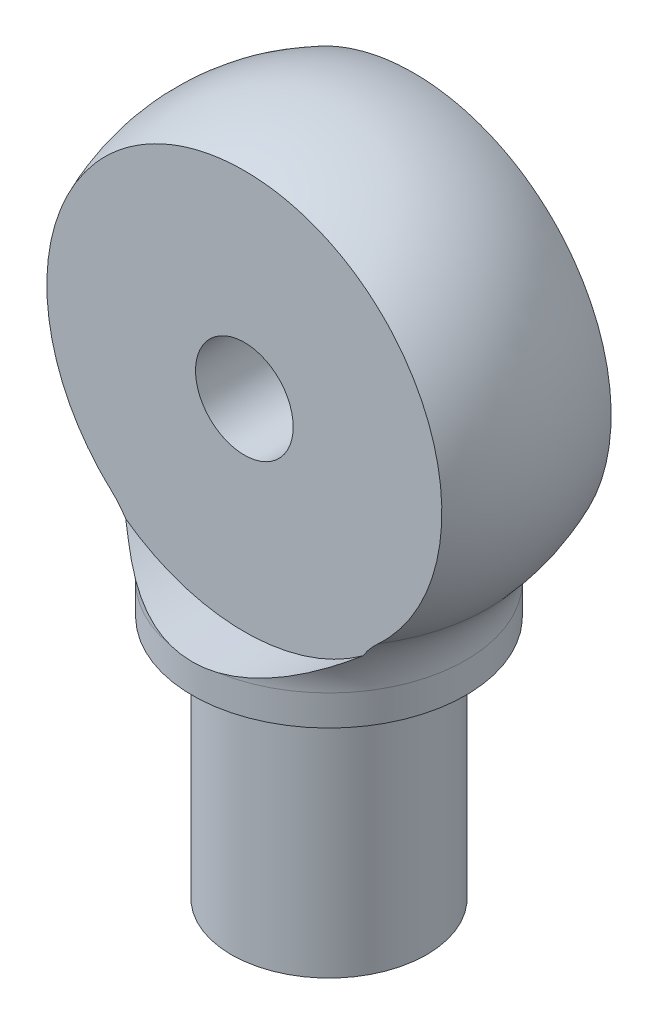
ISO-10303-21;
HEADER;
FILE_DESCRIPTION(('STEP AP214'),'2;1');
FILE_NAME('part.step','',(''),(''),'','','');
FILE_SCHEMA(('AUTOMOTIVE_DESIGN { 1 0 10303 214 1 1 1 1 }'));
ENDSEC;
DATA;
#1=APPLICATION_CONTEXT('core data for automotive mechanical design processes');
#2=APPLICATION_PROTOCOL_DEFINITION('international standard','automotive_design',2000,#1);
#3=PRODUCT_CONTEXT('',#1,'mechanical');
#4=PRODUCT('Part','Part','',(#3));
#5=PRODUCT_RELATED_PRODUCT_CATEGORY('part','',(#4));
#6=PRODUCT_DEFINITION_FORMATION('','',#4);
#7=PRODUCT_DEFINITION_CONTEXT('part definition',#1,'design');
#8=PRODUCT_DEFINITION('design','',#6,#7);
#9=PRODUCT_DEFINITION_SHAPE('','',#8);
#10=(LENGTH_UNIT() NAMED_UNIT(*) SI_UNIT(.MILLI.,.METRE.));
#11=(NAMED_UNIT(*) PLANE_ANGLE_UNIT() SI_UNIT($,.RADIAN.));
#12=(NAMED_UNIT(*) SI_UNIT($,.STERADIAN.) SOLID_ANGLE_UNIT());
#13=UNCERTAINTY_MEASURE_WITH_UNIT(LENGTH_MEASURE(1.E-05),#10,'distance_accuracy_value','');
#14=(GEOMETRIC_REPRESENTATION_CONTEXT(3) GLOBAL_UNCERTAINTY_ASSIGNED_CONTEXT((#13)) GLOBAL_UNIT_ASSIGNED_CONTEXT((#10,
#11,#12)) REPRESENTATION_CONTEXT('',''));
#15=CARTESIAN_POINT('',(0.,0.,0.));
#16=DIRECTION('',(0.,0.,1.));
#17=DIRECTION('',(1.,0.,0.));
#18=AXIS2_PLACEMENT_3D('',#15,#16,#17);
#19=CARTESIAN_POINT('',(0.,37.0615688143396,0.));
#20=DIRECTION('',(0.,-1.,0.));
#21=DIRECTION('',(0.,0.,-1.));
#22=AXIS2_PLACEMENT_3D('',#19,#20,#21);
#23=SPHERICAL_SURFACE('',#22,16.764);
#24=CARTESIAN_POINT('',(0.,37.0615688143396,-6.604));
#25=DIRECTION('',(0.,0.,-1.));
#26=DIRECTION('',(-1.,0.,0.));
#27=AXIS2_PLACEMENT_3D('',#24,#25,#26);
#28=CIRCLE('',#27,15.4084029023128);
#29=CARTESIAN_POINT('',(-10.4273702920411,25.7174589421346,-6.604));
#30=VERTEX_POINT('',#29);
#31=CARTESIAN_POINT('',(10.4273702920411,25.7174589421346,-6.604));
#32=VERTEX_POINT('',#31);
#33=EDGE_CURVE('E232',#30,#32,#28,.T.);
#34=ORIENTED_EDGE('',*,*,#33,.F.);
#35=CARTESIAN_POINT('',(0.,25.7174589421346,0.));
#36=DIRECTION('',(0.,1.,0.));
#37=DIRECTION('',(0.,0.,1.));
#38=AXIS2_PLACEMENT_3D('',#35,#36,#37);
#39=CIRCLE('',#38,12.3427252747253);
#40=CARTESIAN_POINT('',(-10.4273702920411,25.7174589421346,6.604));
#41=VERTEX_POINT('',#40);
#42=EDGE_CURVE('E118',#30,#41,#39,.T.);
#43=ORIENTED_EDGE('',*,*,#42,.T.);
#44=CARTESIAN_POINT('',(0.,37.0615688143396,6.604));
#45=DIRECTION('',(0.,0.,1.));
#46=DIRECTION('',(1.,0.,0.));
#47=AXIS2_PLACEMENT_3D('',#44,#45,#46);
#48=CIRCLE('',#47,15.4084029023128);
#49=CARTESIAN_POINT('',(10.4273702920411,25.7174589421346,6.604));
#50=VERTEX_POINT('',#49);
#51=EDGE_CURVE('E221',#50,#41,#48,.T.);
#52=ORIENTED_EDGE('',*,*,#51,.F.);
#53=CARTESIAN_POINT('',(0.,25.7174589421346,0.));
#54=DIRECTION('',(0.,1.,0.));
#55=DIRECTION('',(0.,0.,1.));
#56=AXIS2_PLACEMENT_3D('',#53,#54,#55);
#57=CIRCLE('',#56,12.3427252747253);
#58=EDGE_CURVE('E116',#50,#32,#57,.T.);
#59=ORIENTED_EDGE('',*,*,#58,.T.);
#60=EDGE_LOOP('',(#34,#43,#52,#59));
#61=FACE_BOUND('',#60,.T.);
#62=ADVANCED_FACE('F33',(#61),#23,.T.);
#63=CARTESIAN_POINT('',(0.,19.05,0.));
#64=DIRECTION('',(0.,-1.,0.));
#65=DIRECTION('',(0.,0.,-1.));
#66=AXIS2_PLACEMENT_3D('',#63,#64,#65);
#67=CYLINDRICAL_SURFACE('',#66,10.668);
#68=CARTESIAN_POINT('',(0.,19.05,0.));
#69=DIRECTION('',(0.,-1.,0.));
#70=DIRECTION('',(0.,0.,-1.));
#71=AXIS2_PLACEMENT_3D('',#68,#69,#70);
#72=CIRCLE('',#71,10.668);
#73=CARTESIAN_POINT('',(0.,19.05,-10.668));
#74=VERTEX_POINT('',#73);
#75=EDGE_CURVE('E216',#74,#74,#72,.T.);
#76=ORIENTED_EDGE('',*,*,#75,.F.);
#77=EDGE_LOOP('',(#76));
#78=FACE_BOUND('',#77,.T.);
#79=CARTESIAN_POINT('',(-8.37815063125508,23.7271735899584,6.604));
#80=CARTESIAN_POINT('',(-8.19221559006035,23.6103199598855,6.8398356371387));
#81=CARTESIAN_POINT('',(-7.99651345477452,23.492809966943,7.06767477892349));
#82=CARTESIAN_POINT('',(-7.58607704736073,23.2591587223438,7.50654113510279));
#83=CARTESIAN_POINT('',(-7.37133219558277,23.1430182726797,7.71755887876648));
#84=CARTESIAN_POINT('',(-6.92154640548567,22.9139182733733,8.12348033112701));
#85=CARTESIAN_POINT('',(-6.68634312858344,22.800995824447,8.31822545926329));
#86=CARTESIAN_POINT('',(-6.19804081928927,22.5820884587365,8.68817175732594));
#87=CARTESIAN_POINT('',(-5.94494435746446,22.4761025496323,8.86337572528624));
#88=CARTESIAN_POINT('',(-5.42055132075689,22.2731772187734,9.1934901668201));
#89=CARTESIAN_POINT('',(-5.14917599794605,22.1762818954638,9.34830305419476));
#90=CARTESIAN_POINT('',(-4.59064852541398,21.9946632546866,9.63486618248662));
#91=CARTESIAN_POINT('',(-4.30349941619754,21.9099376027343,9.76662084768041));
#92=CARTESIAN_POINT('',(-3.716290064751,21.7553439945442,10.0047694459442));
#93=CARTESIAN_POINT('',(-3.41628127967192,21.6854224568058,10.1112550123144));
#94=CARTESIAN_POINT('',(-2.80480600514367,21.5622218312629,10.2976393482671));
#95=CARTESIAN_POINT('',(-2.49334194519949,21.5089392370612,10.3775437196525));
#96=CARTESIAN_POINT('',(-1.90291652561037,21.4264985688751,10.5006636912091));
#97=CARTESIAN_POINT('',(-1.62497436031904,21.3951088692275,10.5472921172689));
#98=CARTESIAN_POINT('',(-1.0650113315467,21.3471111026337,10.618455518542));
#99=CARTESIAN_POINT('',(-0.782990833610243,21.3305017191581,10.6429924615156));
#100=CARTESIAN_POINT('',(-0.217362346599535,21.312526164774,10.6695435097241));
#101=CARTESIAN_POINT('',(0.0662458905616274,21.3111624465287,10.6715539909899));
#102=CARTESIAN_POINT('',(0.632372412531205,21.3237242229593,10.6530052885975));
#103=CARTESIAN_POINT('',(0.914890767162365,21.3376487213145,10.6324475756902));
#104=CARTESIAN_POINT('',(1.44375827429274,21.3779127487898,10.5728048510722));
#105=CARTESIAN_POINT('',(1.69050990285275,21.4026292598088,10.5361389395969));
#106=CARTESIAN_POINT('',(2.17952892236229,21.4631761811819,10.4459414027156));
#107=CARTESIAN_POINT('',(2.42179619486561,21.4990068846549,10.3924093324913));
#108=CARTESIAN_POINT('',(2.90029748594707,21.5810423851018,10.269154375385));
#109=CARTESIAN_POINT('',(3.13653299362807,21.6272445934649,10.1994355283917));
#110=CARTESIAN_POINT('',(3.60178473669602,21.7291400351604,10.044575194934));
#111=CARTESIAN_POINT('',(3.83080060377674,21.7848337517717,9.95943292314153));
#112=CARTESIAN_POINT('',(4.29124734357455,21.9075550288056,9.77017342844499));
#113=CARTESIAN_POINT('',(4.52227617934664,21.9749952980658,9.66534697923025));
#114=CARTESIAN_POINT('',(4.9743851772624,22.1179668550125,9.44062902557357));
#115=CARTESIAN_POINT('',(5.19546121426268,22.1935014545065,9.32073135121905));
#116=CARTESIAN_POINT('',(5.626957400386,22.3513794412856,9.06676851585031));
#117=CARTESIAN_POINT('',(5.83737086181439,22.4337270185645,8.93269462213323));
#118=CARTESIAN_POINT('',(6.24683805753195,22.6038487143259,8.65129783674901));
#119=CARTESIAN_POINT('',(6.44589139236517,22.6916230234026,8.5039744796598));
#120=CARTESIAN_POINT('',(6.8014511444438,22.856926670786,8.22128633145365));
#121=CARTESIAN_POINT('',(6.95968976614681,22.9338655216546,8.0877454306411));
#122=CARTESIAN_POINT('',(7.26758737590545,23.0897596357292,7.8122382525024));
#123=CARTESIAN_POINT('',(7.4172469367363,23.16871476381,7.67027253894421));
#124=CARTESIAN_POINT('',(7.7073064430537,23.3275174744964,7.37874010112471));
#125=CARTESIAN_POINT('',(7.84773573698148,23.4073611798792,7.22920044204029));
#126=CARTESIAN_POINT('',(8.1196787257258,23.5673015122079,6.92235676483113));
#127=CARTESIAN_POINT('',(8.25119258792048,23.647398134376,6.76505289256745));
#128=CARTESIAN_POINT('',(8.37815063125508,23.7271735899584,6.604));
#129=B_SPLINE_CURVE_WITH_KNOTS('',3,(#79,#80,#81,#82,#83,#84,#85,#86,#87,#88,#89,#90,#91,#92,
#93,#94,#95,#96,#97,#98,#99,#100,#101,#102,#103,#104,#105,#106,#107,#108,#109,#110,#111,#112,
#113,#114,#115,#116,#117,#118,#119,#120,#121,#122,#123,#124,#125,#126,#127,#128),.UNSPECIFIED.,
.F.,.F.,(4,2,2,2,2,2,2,2,2,2,2,2,2,2,2,2,2,2,2,2,2,2,2,2,4),(0.,0.966537935886153,
1.9336162609427,2.90922612767135,3.88469612023134,4.864676818641,5.84446927744869,
6.82065248138352,7.79662983094061,8.64611759943226,9.49552969378878,10.3450784362821,
11.1945718176616,11.9457680105236,12.6969840166523,13.4480127357791,14.1990797064496,
14.9858236265525,15.7728906821302,16.5604454357464,17.3480278650968,18.0103661686886,
18.6726602000826,19.3327348819715,19.9927971681974),.UNSPECIFIED.);
#130=CARTESIAN_POINT('',(-1.83162004793565,21.4204476269055,10.5095857197132));
#131=VERTEX_POINT('',#130);
#132=CARTESIAN_POINT('',(1.83162004793566,21.4204476269055,10.5095857197133));
#133=VERTEX_POINT('',#132);
#134=EDGE_CURVE('E94',#131,#133,#129,.T.);
#135=ORIENTED_EDGE('',*,*,#134,.F.);
#136=CARTESIAN_POINT('',(0.,21.4204476269055,0.));
#137=DIRECTION('',(0.,1.,0.));
#138=DIRECTION('',(0.,0.,1.));
#139=AXIS2_PLACEMENT_3D('',#136,#137,#138);
#140=CIRCLE('',#139,10.668);
#141=CARTESIAN_POINT('',(-1.83162004793565,21.4204476269055,-10.5095857197132));
#142=VERTEX_POINT('',#141);
#143=EDGE_CURVE('E106',#131,#142,#140,.F.);
#144=ORIENTED_EDGE('',*,*,#143,.T.);
#145=CARTESIAN_POINT('',(-8.37815063125508,23.7271735899584,-6.60400000000001));
#146=CARTESIAN_POINT('',(-8.19221559006035,23.6103199598855,-6.8398356371387));
#147=CARTESIAN_POINT('',(-7.99651345477452,23.492809966943,-7.06767477892349));
#148=CARTESIAN_POINT('',(-7.58607704736073,23.2591587223438,-7.50654113510279));
#149=CARTESIAN_POINT('',(-7.37133219558277,23.1430182726797,-7.71755887876648));
#150=CARTESIAN_POINT('',(-6.92154640548568,22.9139182733733,-8.12348033112701));
#151=CARTESIAN_POINT('',(-6.68634312858345,22.8009958244471,-8.3182254592633));
#152=CARTESIAN_POINT('',(-6.19804081928927,22.5820884587365,-8.68817175732594));
#153=CARTESIAN_POINT('',(-5.94494435746446,22.4761025496323,-8.86337572528624));
#154=CARTESIAN_POINT('',(-5.4205513207569,22.2731772187734,-9.1934901668201));
#155=CARTESIAN_POINT('',(-5.14917599794606,22.1762818954638,-9.34830305419476));
#156=CARTESIAN_POINT('',(-4.59064852541399,21.9946632546866,-9.63486618248662));
#157=CARTESIAN_POINT('',(-4.30349941619754,21.9099376027343,-9.76662084768041));
#158=CARTESIAN_POINT('',(-3.716290064751,21.7553439945442,-10.0047694459442));
#159=CARTESIAN_POINT('',(-3.41628127967192,21.6854224568058,-10.1112550123144));
#160=CARTESIAN_POINT('',(-2.80480600514368,21.5622218312629,-10.2976393482671));
#161=CARTESIAN_POINT('',(-2.4933419451995,21.5089392370613,-10.3775437196525));
#162=CARTESIAN_POINT('',(-1.90291652561038,21.4264985688751,-10.5006636912091));
#163=CARTESIAN_POINT('',(-1.62497436031905,21.3951088692275,-10.5472921172689));
#164=CARTESIAN_POINT('',(-1.06501133154671,21.3471111026337,-10.618455518542));
#165=CARTESIAN_POINT('',(-0.782990833610253,21.3305017191581,-10.6429924615156));
#166=CARTESIAN_POINT('',(-0.217362346599543,21.312526164774,-10.6695435097241));
#167=CARTESIAN_POINT('',(0.0662458905616194,21.3111624465287,-10.6715539909899));
#168=CARTESIAN_POINT('',(0.632372412531197,21.3237242229593,-10.6530052885975));
#169=CARTESIAN_POINT('',(0.914890767162357,21.3376487213145,-10.6324475756902));
#170=CARTESIAN_POINT('',(1.44375827429273,21.3779127487898,-10.5728048510722));
#171=CARTESIAN_POINT('',(1.69050990285274,21.4026292598088,-10.5361389395969));
#172=CARTESIAN_POINT('',(2.17952892236229,21.4631761811819,-10.4459414027156));
#173=CARTESIAN_POINT('',(2.4217961948656,21.4990068846549,-10.3924093324913));
#174=CARTESIAN_POINT('',(2.90029748594707,21.5810423851018,-10.269154375385));
#175=CARTESIAN_POINT('',(3.13653299362806,21.6272445934649,-10.1994355283917));
#176=CARTESIAN_POINT('',(3.60178473669601,21.7291400351604,-10.0445751949341));
#177=CARTESIAN_POINT('',(3.83080060377674,21.7848337517717,-9.95943292314154));
#178=CARTESIAN_POINT('',(4.29124734357454,21.9075550288056,-9.770173428445));
#179=CARTESIAN_POINT('',(4.52227617934663,21.9749952980658,-9.66534697923025));
#180=CARTESIAN_POINT('',(4.9743851772624,22.1179668550125,-9.44062902557358));
#181=CARTESIAN_POINT('',(5.19546121426267,22.1935014545065,-9.32073135121906));
#182=CARTESIAN_POINT('',(5.626957400386,22.3513794412856,-9.06676851585032));
#183=CARTESIAN_POINT('',(5.83737086181438,22.4337270185645,-8.93269462213324));
#184=CARTESIAN_POINT('',(6.24683805753194,22.6038487143259,-8.65129783674901));
#185=CARTESIAN_POINT('',(6.44589139236517,22.6916230234026,-8.50397447965981));
#186=CARTESIAN_POINT('',(6.8014511444438,22.856926670786,-8.22128633145366));
#187=CARTESIAN_POINT('',(6.95968976614681,22.9338655216546,-8.0877454306411));
#188=CARTESIAN_POINT('',(7.26758737590545,23.0897596357292,-7.8122382525024));
#189=CARTESIAN_POINT('',(7.4172469367363,23.16871476381,-7.67027253894421));
#190=CARTESIAN_POINT('',(7.7073064430537,23.3275174744964,-7.37874010112471));
#191=CARTESIAN_POINT('',(7.84773573698148,23.4073611798792,-7.22920044204029));
#192=CARTESIAN_POINT('',(8.1196787257258,23.5673015122079,-6.92235676483113));
#193=CARTESIAN_POINT('',(8.25119258792048,23.647398134376,-6.76505289256745));
#194=CARTESIAN_POINT('',(8.37815063125508,23.7271735899584,-6.60400000000001));
#195=B_SPLINE_CURVE_WITH_KNOTS('',3,(#145,#146,#147,#148,#149,#150,#151,#152,#153,#154,#155,
#156,#157,#158,#159,#160,#161,#162,#163,#164,#165,#166,#167,#168,#169,#170,#171,#172,#173,#174,
#175,#176,#177,#178,#179,#180,#181,#182,#183,#184,#185,#186,#187,#188,#189,#190,#191,#192,#193,
#194),.UNSPECIFIED.,.F.,.F.,(4,2,2,2,2,2,2,2,2,2,2,2,2,2,2,2,2,2,2,2,2,2,2,2,4),(0.,
0.966537935886154,1.9336162609427,2.90922612767135,3.88469612023134,4.864676818641,
5.84446927744868,6.82065248138351,7.79662983094061,8.64611759943225,9.49552969378877,
10.3450784362821,11.1945718176616,11.9457680105236,12.6969840166523,13.4480127357791,
14.1990797064496,14.9858236265525,15.7728906821302,16.5604454357464,17.3480278650968,
18.0103661686886,18.6726602000826,19.3327348819715,19.9927971681974),.UNSPECIFIED.);
#196=CARTESIAN_POINT('',(1.83162004793566,21.4204476269055,-10.5095857197133));
#197=VERTEX_POINT('',#196);
#198=EDGE_CURVE('E110',#142,#197,#195,.T.);
#199=ORIENTED_EDGE('',*,*,#198,.T.);
#200=CARTESIAN_POINT('',(0.,21.4204476269055,0.));
#201=DIRECTION('',(0.,1.,0.));
#202=DIRECTION('',(0.,0.,1.));
#203=AXIS2_PLACEMENT_3D('',#200,#201,#202);
#204=CIRCLE('',#203,10.668);
#205=EDGE_CURVE('E109',#197,#133,#204,.F.);
#206=ORIENTED_EDGE('',*,*,#205,.T.);
#207=EDGE_LOOP('',(#135,#144,#199,#206));
#208=FACE_BOUND('',#207,.T.);
#209=ADVANCED_FACE('F104',(#78,#208),#67,.T.);
#210=CARTESIAN_POINT('',(0.,37.0615688143396,-16.764));
#211=DIRECTION('',(0.,0.,1.));
#212=DIRECTION('',(1.,0.,0.));
#213=AXIS2_PLACEMENT_3D('',#210,#211,#212);
#214=CYLINDRICAL_SURFACE('',#213,3.81);
#215=CARTESIAN_POINT('',(0.,37.0615688143396,6.604));
#216=DIRECTION('',(0.,0.,1.));
#217=DIRECTION('',(1.,0.,0.));
#218=AXIS2_PLACEMENT_3D('',#215,#216,#217);
#219=CIRCLE('',#218,3.81);
#220=CARTESIAN_POINT('',(3.81,37.0615688143396,6.604));
#221=VERTEX_POINT('',#220);
#222=EDGE_CURVE('E224',#221,#221,#219,.F.);
#223=ORIENTED_EDGE('',*,*,#222,.F.);
#224=EDGE_LOOP('',(#223));
#225=FACE_BOUND('',#224,.T.);
#226=CARTESIAN_POINT('',(0.,37.0615688143396,-6.604));
#227=DIRECTION('',(0.,0.,-1.));
#228=DIRECTION('',(-1.,0.,0.));
#229=AXIS2_PLACEMENT_3D('',#226,#227,#228);
#230=CIRCLE('',#229,3.81);
#231=CARTESIAN_POINT('',(-3.81,37.0615688143396,-6.604));
#232=VERTEX_POINT('',#231);
#233=EDGE_CURVE('E231',#232,#232,#230,.F.);
#234=ORIENTED_EDGE('',*,*,#233,.F.);
#235=EDGE_LOOP('',(#234));
#236=FACE_BOUND('',#235,.T.);
#237=ADVANCED_FACE('F196',(#225,#236),#214,.F.);
#238=CARTESIAN_POINT('',(0.,19.05,0.));
#239=DIRECTION('',(0.,-1.,0.));
#240=DIRECTION('',(0.,0.,-1.));
#241=AXIS2_PLACEMENT_3D('',#238,#239,#240);
#242=CYLINDRICAL_SURFACE('',#241,7.62);
#243=CARTESIAN_POINT('',(0.,19.05,0.));
#244=DIRECTION('',(0.,1.,0.));
#245=DIRECTION('',(0.,0.,1.));
#246=AXIS2_PLACEMENT_3D('',#243,#244,#245);
#247=CIRCLE('',#246,7.62);
#248=CARTESIAN_POINT('',(0.,19.05,7.62));
#249=VERTEX_POINT('',#248);
#250=EDGE_CURVE('E111',#249,#249,#247,.T.);
#251=ORIENTED_EDGE('',*,*,#250,.F.);
#252=EDGE_LOOP('',(#251));
#253=FACE_BOUND('',#252,.T.);
#254=CARTESIAN_POINT('',(0.,0.,0.));
#255=DIRECTION('',(0.,1.,0.));
#256=DIRECTION('',(0.,0.,1.));
#257=AXIS2_PLACEMENT_3D('',#254,#255,#256);
#258=CIRCLE('',#257,7.62);
#259=CARTESIAN_POINT('',(0.,0.,7.62));
#260=VERTEX_POINT('',#259);
#261=EDGE_CURVE('E214',#260,#260,#258,.T.);
#262=ORIENTED_EDGE('',*,*,#261,.T.);
#263=EDGE_LOOP('',(#262));
#264=FACE_BOUND('',#263,.T.);
#265=ADVANCED_FACE('F143',(#253,#264),#242,.T.);
#266=CARTESIAN_POINT('',(0.,0.,0.));
#267=DIRECTION('',(0.,1.,0.));
#268=DIRECTION('',(0.,0.,1.));
#269=AXIS2_PLACEMENT_3D('',#266,#267,#268);
#270=PLANE('',#269);
#271=ORIENTED_EDGE('',*,*,#261,.F.);
#272=EDGE_LOOP('',(#271));
#273=FACE_BOUND('',#272,.T.);
#274=ADVANCED_FACE('F204',(#273),#270,.F.);
#275=CARTESIAN_POINT('',(0.,19.05,10.668));
#276=DIRECTION('',(0.,1.,0.));
#277=DIRECTION('',(0.,0.,1.));
#278=AXIS2_PLACEMENT_3D('',#275,#276,#277);
#279=PLANE('',#278);
#280=ORIENTED_EDGE('',*,*,#250,.T.);
#281=EDGE_LOOP('',(#280));
#282=FACE_BOUND('',#281,.T.);
#283=ORIENTED_EDGE('',*,*,#75,.T.);
#284=EDGE_LOOP('',(#283));
#285=FACE_BOUND('',#284,.T.);
#286=ADVANCED_FACE('F202',(#282,#285),#279,.F.);
#287=CARTESIAN_POINT('',(0.,37.0615688143396,24.384));
#288=DIRECTION('',(0.,0.,-1.));
#289=DIRECTION('',(-1.,0.,0.));
#290=AXIS2_PLACEMENT_3D('',#287,#288,#289);
#291=CYLINDRICAL_SURFACE('',#290,15.748);
#292=CARTESIAN_POINT('',(0.,37.0615688143396,6.604));
#293=DIRECTION('',(0.,0.,1.));
#294=DIRECTION('',(1.,0.,0.));
#295=AXIS2_PLACEMENT_3D('',#292,#293,#294);
#296=CIRCLE('',#295,15.748);
#297=CARTESIAN_POINT('',(-9.25299699148074,24.3186668420396,6.604));
#298=VERTEX_POINT('',#297);
#299=CARTESIAN_POINT('',(9.25299699148074,24.3186668420396,6.604));
#300=VERTEX_POINT('',#299);
#301=EDGE_CURVE('E61',#298,#300,#296,.T.);
#302=ORIENTED_EDGE('',*,*,#301,.F.);
#303=CARTESIAN_POINT('',(-9.25299699148074,24.3186668420395,6.604));
#304=CARTESIAN_POINT('',(-9.15867604968041,24.2501878441369,6.67574398980279));
#305=CARTESIAN_POINT('',(-9.06421267792738,24.1831845703198,6.74867733531758));
#306=CARTESIAN_POINT('',(-8.8746527778054,24.0518260085424,6.89606896056554));
#307=CARTESIAN_POINT('',(-8.7795563125601,23.9874704610477,6.97052708976013));
#308=CARTESIAN_POINT('',(-8.58833065679997,23.8610688223374,7.12015466176887));
#309=CARTESIAN_POINT('',(-8.49220112236136,23.7990235329948,7.19532434040897));
#310=CARTESIAN_POINT('',(-8.2986724227647,23.677077082127,7.34577133538204));
#311=CARTESIAN_POINT('',(-8.20127322532619,23.6171759752619,7.4210486544082));
#312=CARTESIAN_POINT('',(-7.90533659767014,23.4395860246529,7.64743681303647));
#313=CARTESIAN_POINT('',(-7.70449361722089,23.3249586512083,7.79796078551812));
#314=CARTESIAN_POINT('',(-7.29535730891426,23.1033692072393,8.09440656383815));
#315=CARTESIAN_POINT('',(-7.08706517799952,22.9964059134591,8.24032910201555));
#316=CARTESIAN_POINT('',(-6.67087681275505,22.7944683947744,8.51936570023546));
#317=CARTESIAN_POINT('',(-6.46332166420684,22.6991810656848,8.65275994607568));
#318=CARTESIAN_POINT('',(-6.03992380930206,22.5160533418011,8.9113826244739));
#319=CARTESIAN_POINT('',(-5.82408001963111,22.4282139252853,9.03660998381974));
#320=CARTESIAN_POINT('',(-5.3845743992784,22.2608603966868,9.27673040212329));
#321=CARTESIAN_POINT('',(-5.16094019136746,22.1813202104426,9.3916556569802));
#322=CARTESIAN_POINT('',(-4.70526199190713,22.0310155148582,9.60985897369969));
#323=CARTESIAN_POINT('',(-4.47322115349202,21.9602477583282,9.71314134398474));
#324=CARTESIAN_POINT('',(-4.04778242616335,21.8413979167667,9.88721360399827));
#325=CARTESIAN_POINT('',(-3.85583793926896,21.7915992286379,9.96038669343752));
#326=CARTESIAN_POINT('',(-3.46698212675387,21.6986423194798,10.0972880175637));
#327=CARTESIAN_POINT('',(-3.27007006010189,21.6554850960806,10.1610148332508));
#328=CARTESIAN_POINT('',(-2.86855046414386,21.5756573963625,10.2790974843496));
#329=CARTESIAN_POINT('',(-2.66386997527526,21.5391031563331,10.3332850395012));
#330=CARTESIAN_POINT('',(-2.25053502573759,21.4738007933114,10.4302221151908));
#331=CARTESIAN_POINT('',(-2.04187940445669,21.4450549887029,10.4729682386257));
#332=CARTESIAN_POINT('',(-1.83162004793566,21.4204476269055,10.5095857197132));
#333=B_SPLINE_CURVE_WITH_KNOTS('',3,(#303,#304,#305,#306,#307,#308,#309,#310,#311,#312,#313,
#314,#315,#316,#317,#318,#319,#320,#321,#322,#323,#324,#325,#326,#327,#328,#329,#330,#331,#332),
.UNSPECIFIED.,.F.,.F.,(4,2,2,2,2,2,2,2,2,2,2,2,2,2,4),(0.,0.410569134370835,0.821097927719356,
1.23176790886028,1.64244835148903,2.46999779405493,3.29741485673899,4.09055370808074,
4.88379657680921,5.67446706010524,6.46484399044721,7.09861091960369,7.73247295565488,
8.37658947142005,9.02089702175278),.UNSPECIFIED.);
#334=EDGE_CURVE('E91',#298,#131,#333,.T.);
#335=ORIENTED_EDGE('',*,*,#334,.T.);
#336=ORIENTED_EDGE('',*,*,#134,.T.);
#337=CARTESIAN_POINT('',(1.83162004793563,21.4204476269055,10.5095857197132));
#338=CARTESIAN_POINT('',(1.96436483535823,21.4359910175211,10.4864535271072));
#339=CARTESIAN_POINT('',(2.09647251630054,21.4531759505413,10.4608930466585));
#340=CARTESIAN_POINT('',(2.35922062900428,21.4907247632072,10.4050965074962));
#341=CARTESIAN_POINT('',(2.48986127989797,21.5110881611244,10.3748611573129));
#342=CARTESIAN_POINT('',(2.87894146258188,21.5767282475292,10.2775056069652));
#343=CARTESIAN_POINT('',(3.1349612898265,21.6266047811069,10.203661401545));
#344=CARTESIAN_POINT('',(3.63589633923967,21.7369243811626,10.040833866554));
#345=CARTESIAN_POINT('',(3.88091254903372,21.7972219329195,9.95205942358601));
#346=CARTESIAN_POINT('',(4.36271458762425,21.9278791199618,9.76046224060061));
#347=CARTESIAN_POINT('',(4.59949665484149,21.9982432807938,9.65763318312106));
#348=CARTESIAN_POINT('',(5.2040724051957,22.1931454032805,9.37426369797311));
#349=CARTESIAN_POINT('',(5.56509965920621,22.3248304710717,9.18415426983378));
#350=CARTESIAN_POINT('',(6.26507531310329,22.6084976950659,8.77992343518065));
#351=CARTESIAN_POINT('',(6.60401028691552,22.7604920257619,8.56578763837348));
#352=CARTESIAN_POINT('',(7.09795940141831,23.0026842635526,8.23199179200503));
#353=CARTESIAN_POINT('',(7.26055378629059,23.0859877694247,8.11835463633534));
#354=CARTESIAN_POINT('',(7.58112451886115,23.2572542314911,7.88811541718343));
#355=CARTESIAN_POINT('',(7.73910099841423,23.3452170544463,7.77151343853372));
#356=CARTESIAN_POINT('',(8.05094971303174,23.5259057031499,7.53671460124284));
#357=CARTESIAN_POINT('',(8.20482368451166,23.6186294635672,7.41851845030159));
#358=CARTESIAN_POINT('',(8.50932873111227,23.8092815314437,7.1821717727284));
#359=CARTESIAN_POINT('',(8.6599601096303,23.9072093489786,7.06402124285271));
#360=CARTESIAN_POINT('',(8.88392574374688,24.058360965731,6.88894766976301));
#361=CARTESIAN_POINT('',(8.95806345208478,24.1093189826132,6.8310938805399));
#362=CARTESIAN_POINT('',(9.10582508825544,24.2127731839752,6.71657867397993));
#363=CARTESIAN_POINT('',(9.17944980966778,24.2652655188487,6.65991479820323));
#364=CARTESIAN_POINT('',(9.25299699148074,24.3186668420396,6.60400000000001));
#365=B_SPLINE_CURVE_WITH_KNOTS('',3,(#337,#338,#339,#340,#341,#342,#343,#344,#345,#346,#347,
#348,#349,#350,#351,#352,#353,#354,#355,#356,#357,#358,#359,#360,#361,#362,#363,#364),
.UNSPECIFIED.,.F.,.F.,(4,2,2,2,2,2,2,2,2,2,2,2,2,4),(0.,0.406844583227671,0.8136275648004,
1.62590329308664,2.4276385651224,3.22973540467105,4.51378010030736,5.79859800566608,
6.44395225644438,7.08928806242451,7.73434624387806,8.37934380497223,8.7002040891761,
9.02031875158265),.UNSPECIFIED.);
#366=EDGE_CURVE('E98',#133,#300,#365,.T.);
#367=ORIENTED_EDGE('',*,*,#366,.T.);
#368=EDGE_LOOP('',(#302,#335,#336,#367));
#369=FACE_BOUND('',#368,.T.);
#370=ADVANCED_FACE('F93',(#369),#291,.F.);
#371=CARTESIAN_POINT('',(0.,37.0615688143396,6.604));
#372=DIRECTION('',(0.,0.,1.));
#373=DIRECTION('',(1.,0.,0.));
#374=AXIS2_PLACEMENT_3D('',#371,#372,#373);
#375=PLANE('',#374);
#376=ORIENTED_EDGE('',*,*,#222,.T.);
#377=EDGE_LOOP('',(#376));
#378=FACE_BOUND('',#377,.T.);
#379=ORIENTED_EDGE('',*,*,#51,.T.);
#380=CARTESIAN_POINT('',(-10.4273702920411,25.7174589421346,6.604));
#381=CARTESIAN_POINT('',(-10.3147565616724,25.6139388051629,6.604));
#382=CARTESIAN_POINT('',(-10.2053200543649,25.5069317184762,6.604));
#383=CARTESIAN_POINT('',(-9.9939474738842,25.2866488267844,6.604));
#384=CARTESIAN_POINT('',(-9.89198082127966,25.1734023412266,6.604));
#385=CARTESIAN_POINT('',(-9.69570114034709,24.9404398479199,6.604));
#386=CARTESIAN_POINT('',(-9.60138815108084,24.8207238071578,6.604));
#387=CARTESIAN_POINT('',(-9.42080662909392,24.5745705031845,6.604));
#388=CARTESIAN_POINT('',(-9.3345750768589,24.4481061383611,6.604));
#389=CARTESIAN_POINT('',(-9.25299699148074,24.3186668420395,6.604));
#390=B_SPLINE_CURVE_WITH_KNOTS('',3,(#380,#381,#382,#383,#384,#385,#386,#387,#388,#389),
.UNSPECIFIED.,.F.,.F.,(4,2,2,2,4),(0.,0.4588517859613,0.915705930028768,1.37256240558241,
1.83141663815088),.UNSPECIFIED.);
#391=EDGE_CURVE('E99',#41,#298,#390,.T.);
#392=ORIENTED_EDGE('',*,*,#391,.T.);
#393=ORIENTED_EDGE('',*,*,#301,.T.);
#394=CARTESIAN_POINT('',(9.25299699148074,24.3186668420395,6.604));
#395=CARTESIAN_POINT('',(9.3345750768589,24.4481061383611,6.604));
#396=CARTESIAN_POINT('',(9.42080662909392,24.5745705031845,6.604));
#397=CARTESIAN_POINT('',(9.60138815108084,24.8207238071578,6.604));
#398=CARTESIAN_POINT('',(9.69570114034709,24.9404398479199,6.604));
#399=CARTESIAN_POINT('',(9.89198082127965,25.1734023412266,6.604));
#400=CARTESIAN_POINT('',(9.99394747388419,25.2866488267844,6.604));
#401=CARTESIAN_POINT('',(10.2053200543649,25.5069317184762,6.604));
#402=CARTESIAN_POINT('',(10.3147565616724,25.6139388051629,6.604));
#403=CARTESIAN_POINT('',(10.4273702920411,25.7174589421346,6.604));
#404=B_SPLINE_CURVE_WITH_KNOTS('',3,(#394,#395,#396,#397,#398,#399,#400,#401,#402,#403),
.UNSPECIFIED.,.F.,.F.,(4,2,2,2,4),(0.,0.458854232568462,0.915710708122109,1.37256485218957,
1.83141663815087),.UNSPECIFIED.);
#405=EDGE_CURVE('E166',#300,#50,#404,.T.);
#406=ORIENTED_EDGE('',*,*,#405,.T.);
#407=EDGE_LOOP('',(#379,#392,#393,#406));
#408=FACE_BOUND('',#407,.T.);
#409=ADVANCED_FACE('F158',(#378,#408),#375,.T.);
#410=CARTESIAN_POINT('',(0.,37.0615688143396,-24.384));
#411=DIRECTION('',(0.,0.,1.));
#412=DIRECTION('',(1.,0.,0.));
#413=AXIS2_PLACEMENT_3D('',#410,#411,#412);
#414=CYLINDRICAL_SURFACE('',#413,15.748);
#415=CARTESIAN_POINT('',(0.,37.0615688143396,-6.604));
#416=DIRECTION('',(0.,0.,1.));
#417=DIRECTION('',(1.,0.,0.));
#418=AXIS2_PLACEMENT_3D('',#415,#416,#417);
#419=CIRCLE('',#418,15.748);
#420=CARTESIAN_POINT('',(-9.25299699148074,24.3186668420396,-6.604));
#421=VERTEX_POINT('',#420);
#422=CARTESIAN_POINT('',(9.25299699148074,24.3186668420396,-6.604));
#423=VERTEX_POINT('',#422);
#424=EDGE_CURVE('E53',#421,#423,#419,.T.);
#425=ORIENTED_EDGE('',*,*,#424,.T.);
#426=CARTESIAN_POINT('',(9.25299699148074,24.3186668420396,-6.604));
#427=CARTESIAN_POINT('',(9.15867604968041,24.2501878441369,-6.6757439898028));
#428=CARTESIAN_POINT('',(9.06421267792738,24.1831845703198,-6.74867733531758));
#429=CARTESIAN_POINT('',(8.87465277780541,24.0518260085424,-6.89606896056554));
#430=CARTESIAN_POINT('',(8.7795563125601,23.9874704610477,-6.97052708976013));
#431=CARTESIAN_POINT('',(8.58833065679997,23.8610688223374,-7.12015466176886));
#432=CARTESIAN_POINT('',(8.49220112236137,23.7990235329948,-7.19532434040897));
#433=CARTESIAN_POINT('',(8.2986724227647,23.677077082127,-7.34577133538204));
#434=CARTESIAN_POINT('',(8.20127322532619,23.6171759752619,-7.4210486544082));
#435=CARTESIAN_POINT('',(7.90533659767014,23.4395860246529,-7.64743681303647));
#436=CARTESIAN_POINT('',(7.70449361722089,23.3249586512083,-7.79796078551812));
#437=CARTESIAN_POINT('',(7.29535730891426,23.1033692072393,-8.09440656383815));
#438=CARTESIAN_POINT('',(7.08706517799952,22.9964059134591,-8.24032910201554));
#439=CARTESIAN_POINT('',(6.67087681275505,22.7944683947744,-8.51936570023546));
#440=CARTESIAN_POINT('',(6.46332166420684,22.6991810656848,-8.65275994607568));
#441=CARTESIAN_POINT('',(6.03992380930207,22.5160533418011,-8.9113826244739));
#442=CARTESIAN_POINT('',(5.82408001963111,22.4282139252853,-9.03660998381974));
#443=CARTESIAN_POINT('',(5.3845743992784,22.2608603966868,-9.27673040212329));
#444=CARTESIAN_POINT('',(5.16094019136746,22.1813202104426,-9.3916556569802));
#445=CARTESIAN_POINT('',(4.70526199190713,22.0310155148582,-9.60985897369969));
#446=CARTESIAN_POINT('',(4.47322115349202,21.9602477583282,-9.71314134398474));
#447=CARTESIAN_POINT('',(4.04778242616335,21.8413979167667,-9.88721360399828));
#448=CARTESIAN_POINT('',(3.85583793926896,21.7915992286379,-9.96038669343752));
#449=CARTESIAN_POINT('',(3.46698212675387,21.6986423194798,-10.0972880175637));
#450=CARTESIAN_POINT('',(3.27007006010189,21.6554850960806,-10.1610148332508));
#451=CARTESIAN_POINT('',(2.86855046414386,21.5756573963625,-10.2790974843496));
#452=CARTESIAN_POINT('',(2.66386997527526,21.5391031563331,-10.3332850395012));
#453=CARTESIAN_POINT('',(2.25053502573759,21.4738007933114,-10.4302221151908));
#454=CARTESIAN_POINT('',(2.04187940445669,21.4450549887029,-10.4729682386258));
#455=CARTESIAN_POINT('',(1.83162004793566,21.4204476269055,-10.5095857197132));
#456=B_SPLINE_CURVE_WITH_KNOTS('',3,(#426,#427,#428,#429,#430,#431,#432,#433,#434,#435,#436,
#437,#438,#439,#440,#441,#442,#443,#444,#445,#446,#447,#448,#449,#450,#451,#452,#453,#454,#455),
.UNSPECIFIED.,.F.,.F.,(4,2,2,2,2,2,2,2,2,2,2,2,2,2,4),(0.,0.410569134370837,0.82109792771936,
1.23176790886028,1.64244835148903,2.46999779405493,3.29741485673899,4.09055370808074,
4.88379657680921,5.67446706010524,6.46484399044721,7.09861091960369,7.73247295565489,
8.37658947142005,9.02089702175279),.UNSPECIFIED.);
#457=EDGE_CURVE('E11',#423,#197,#456,.T.);
#458=ORIENTED_EDGE('',*,*,#457,.T.);
#459=ORIENTED_EDGE('',*,*,#198,.F.);
#460=CARTESIAN_POINT('',(-1.8316200479355,21.4204476269055,-10.5095857197133));
#461=CARTESIAN_POINT('',(-1.9643648353581,21.4359910175211,-10.4864535271072));
#462=CARTESIAN_POINT('',(-2.09647251630041,21.4531759505413,-10.4608930466585));
#463=CARTESIAN_POINT('',(-2.35922062900416,21.4907247632072,-10.4050965074962));
#464=CARTESIAN_POINT('',(-2.48986127989784,21.5110881611244,-10.374861157313));
#465=CARTESIAN_POINT('',(-2.87894146258176,21.5767282475291,-10.2775056069652));
#466=CARTESIAN_POINT('',(-3.13496128982638,21.6266047811068,-10.2036614015451));
#467=CARTESIAN_POINT('',(-3.63589633923956,21.7369243811625,-10.0408338665541));
#468=CARTESIAN_POINT('',(-3.8809125490336,21.7972219329195,-9.95205942358606));
#469=CARTESIAN_POINT('',(-4.36271458762414,21.9278791199618,-9.76046224060066));
#470=CARTESIAN_POINT('',(-4.59949665484137,21.9982432807938,-9.65763318312111));
#471=CARTESIAN_POINT('',(-5.20407240519558,22.1931454032805,-9.37426369797317));
#472=CARTESIAN_POINT('',(-5.56509965920609,22.3248304710717,-9.18415426983385));
#473=CARTESIAN_POINT('',(-6.26507531310315,22.6084976950658,-8.77992343518074));
#474=CARTESIAN_POINT('',(-6.60401028691538,22.7604920257619,-8.56578763837357));
#475=CARTESIAN_POINT('',(-7.09795940141816,23.0026842635526,-8.23199179200513));
#476=CARTESIAN_POINT('',(-7.26055378629044,23.0859877694246,-8.11835463633545));
#477=CARTESIAN_POINT('',(-7.581124518861,23.2572542314911,-7.88811541718354));
#478=CARTESIAN_POINT('',(-7.73910099841408,23.3452170544462,-7.77151343853384));
#479=CARTESIAN_POINT('',(-8.05094971303158,23.5259057031498,-7.53671460124296));
#480=CARTESIAN_POINT('',(-8.2048236845115,23.6186294635671,-7.41851845030172));
#481=CARTESIAN_POINT('',(-8.5093287311121,23.8092815314436,-7.18217177272854));
#482=CARTESIAN_POINT('',(-8.65996010963014,23.9072093489785,-7.06402124285284));
#483=CARTESIAN_POINT('',(-8.88392574374674,24.0583609657309,-6.88894766976312));
#484=CARTESIAN_POINT('',(-8.95806345208467,24.1093189826131,-6.83109388053999));
#485=CARTESIAN_POINT('',(-9.10582508825538,24.2127731839752,-6.71657867397997));
#486=CARTESIAN_POINT('',(-9.17944980966776,24.2652655188487,-6.65991479820325));
#487=CARTESIAN_POINT('',(-9.25299699148074,24.3186668420396,-6.60400000000001));
#488=B_SPLINE_CURVE_WITH_KNOTS('',3,(#460,#461,#462,#463,#464,#465,#466,#467,#468,#469,#470,
#471,#472,#473,#474,#475,#476,#477,#478,#479,#480,#481,#482,#483,#484,#485,#486,#487),
.UNSPECIFIED.,.F.,.F.,(4,2,2,2,2,2,2,2,2,2,2,2,2,4),(0.,0.40684458322767,0.813627564800401,
1.62590329308665,2.4276385651224,3.22973540467105,4.51378010030733,5.79859800566603,
6.44395225644432,7.08928806242443,7.73434624387797,8.37934380497213,8.70020408917612,
9.02031875158279),.UNSPECIFIED.);
#489=EDGE_CURVE('E115',#142,#421,#488,.T.);
#490=ORIENTED_EDGE('',*,*,#489,.T.);
#491=EDGE_LOOP('',(#425,#458,#459,#490));
#492=FACE_BOUND('',#491,.T.);
#493=ADVANCED_FACE('F136',(#492),#414,.F.);
#494=CARTESIAN_POINT('',(0.,37.0615688143396,-6.604));
#495=DIRECTION('',(0.,0.,-1.));
#496=DIRECTION('',(1.,0.,0.));
#497=AXIS2_PLACEMENT_3D('',#494,#495,#496);
#498=PLANE('',#497);
#499=ORIENTED_EDGE('',*,*,#233,.T.);
#500=EDGE_LOOP('',(#499));
#501=FACE_BOUND('',#500,.T.);
#502=ORIENTED_EDGE('',*,*,#33,.T.);
#503=CARTESIAN_POINT('',(10.4273702920411,25.7174589421346,-6.604));
#504=CARTESIAN_POINT('',(10.3147565616724,25.6139388051629,-6.604));
#505=CARTESIAN_POINT('',(10.2053200543649,25.5069317184762,-6.604));
#506=CARTESIAN_POINT('',(9.9939474738842,25.2866488267844,-6.604));
#507=CARTESIAN_POINT('',(9.89198082127966,25.1734023412266,-6.604));
#508=CARTESIAN_POINT('',(9.6957011403471,24.9404398479199,-6.604));
#509=CARTESIAN_POINT('',(9.60138815108084,24.8207238071578,-6.604));
#510=CARTESIAN_POINT('',(9.42080662909392,24.5745705031845,-6.604));
#511=CARTESIAN_POINT('',(9.3345750768589,24.4481061383611,-6.604));
#512=CARTESIAN_POINT('',(9.25299699148074,24.3186668420396,-6.604));
#513=B_SPLINE_CURVE_WITH_KNOTS('',3,(#503,#504,#505,#506,#507,#508,#509,#510,#511,#512),
.UNSPECIFIED.,.F.,.F.,(4,2,2,2,4),(0.,0.458851785961298,0.915705930028762,1.37256240558241,
1.83141663815087),.UNSPECIFIED.);
#514=EDGE_CURVE('E47',#32,#423,#513,.T.);
#515=ORIENTED_EDGE('',*,*,#514,.T.);
#516=ORIENTED_EDGE('',*,*,#424,.F.);
#517=CARTESIAN_POINT('',(-9.25299699148074,24.3186668420396,-6.604));
#518=CARTESIAN_POINT('',(-9.3345750768589,24.4481061383611,-6.604));
#519=CARTESIAN_POINT('',(-9.42080662909392,24.5745705031845,-6.604));
#520=CARTESIAN_POINT('',(-9.60138815108084,24.8207238071578,-6.604));
#521=CARTESIAN_POINT('',(-9.6957011403471,24.9404398479199,-6.604));
#522=CARTESIAN_POINT('',(-9.89198082127966,25.1734023412266,-6.604));
#523=CARTESIAN_POINT('',(-9.9939474738842,25.2866488267844,-6.604));
#524=CARTESIAN_POINT('',(-10.2053200543649,25.5069317184762,-6.604));
#525=CARTESIAN_POINT('',(-10.3147565616724,25.6139388051629,-6.604));
#526=CARTESIAN_POINT('',(-10.4273702920411,25.7174589421346,-6.604));
#527=B_SPLINE_CURVE_WITH_KNOTS('',3,(#517,#518,#519,#520,#521,#522,#523,#524,#525,#526),
.UNSPECIFIED.,.F.,.F.,(4,2,2,2,4),(0.,0.458854232568463,0.915710708122111,1.37256485218958,
1.83141663815087),.UNSPECIFIED.);
#528=EDGE_CURVE('E129',#421,#30,#527,.T.);
#529=ORIENTED_EDGE('',*,*,#528,.T.);
#530=EDGE_LOOP('',(#502,#515,#516,#529));
#531=FACE_BOUND('',#530,.T.);
#532=ADVANCED_FACE('F142',(#501,#531),#498,.T.);
#533=CARTESIAN_POINT('',(0.,21.4204476269055,0.));
#534=DIRECTION('',(0.,1.,0.));
#535=DIRECTION('',(0.,0.,1.));
#536=AXIS2_PLACEMENT_3D('',#533,#534,#535);
#537=TOROIDAL_SURFACE('',#536,17.018,6.35);
#538=ORIENTED_EDGE('',*,*,#391,.F.);
#539=ORIENTED_EDGE('',*,*,#42,.F.);
#540=ORIENTED_EDGE('',*,*,#528,.F.);
#541=ORIENTED_EDGE('',*,*,#489,.F.);
#542=ORIENTED_EDGE('',*,*,#143,.F.);
#543=ORIENTED_EDGE('',*,*,#334,.F.);
#544=EDGE_LOOP('',(#538,#539,#540,#541,#542,#543));
#545=FACE_BOUND('',#544,.T.);
#546=ADVANCED_FACE('F113',(#545),#537,.F.);
#547=CARTESIAN_POINT('',(0.,21.4204476269055,0.));
#548=DIRECTION('',(0.,1.,0.));
#549=DIRECTION('',(0.,0.,1.));
#550=AXIS2_PLACEMENT_3D('',#547,#548,#549);
#551=TOROIDAL_SURFACE('',#550,17.018,6.35);
#552=ORIENTED_EDGE('',*,*,#514,.F.);
#553=ORIENTED_EDGE('',*,*,#58,.F.);
#554=ORIENTED_EDGE('',*,*,#405,.F.);
#555=ORIENTED_EDGE('',*,*,#366,.F.);
#556=ORIENTED_EDGE('',*,*,#205,.F.);
#557=ORIENTED_EDGE('',*,*,#457,.F.);
#558=EDGE_LOOP('',(#552,#553,#554,#555,#556,#557));
#559=FACE_BOUND('',#558,.T.);
#560=ADVANCED_FACE('F35',(#559),#551,.F.);
#561=CLOSED_SHELL('',(#62,#209,#237,#265,#274,#286,#370,#409,#493,#532,#546,#560));
#562=MANIFOLD_SOLID_BREP('B2',#561);
#563=ADVANCED_BREP_SHAPE_REPRESENTATION('',(#18,#562),#14);
#564=SHAPE_DEFINITION_REPRESENTATION(#9,#563);
ENDSEC;
END-ISO-10303-21;
